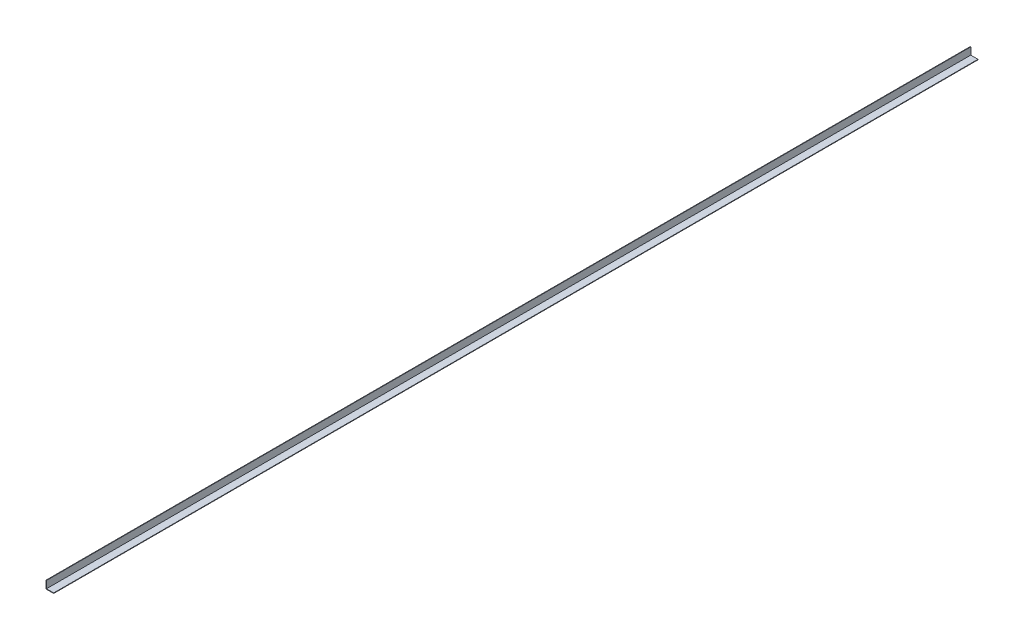
ISO-10303-21;
HEADER;
FILE_DESCRIPTION(('STEP AP214'),'2;1');
FILE_NAME('part.step','',(''),(''),'','','');
FILE_SCHEMA(('AUTOMOTIVE_DESIGN { 1 0 10303 214 1 1 1 1 }'));
ENDSEC;
DATA;
#1=APPLICATION_CONTEXT('core data for automotive mechanical design processes');
#2=APPLICATION_PROTOCOL_DEFINITION('international standard','automotive_design',2000,#1);
#3=PRODUCT_CONTEXT('',#1,'mechanical');
#4=PRODUCT('Part','Part','',(#3));
#5=PRODUCT_RELATED_PRODUCT_CATEGORY('part','',(#4));
#6=PRODUCT_DEFINITION_FORMATION('','',#4);
#7=PRODUCT_DEFINITION_CONTEXT('part definition',#1,'design');
#8=PRODUCT_DEFINITION('design','',#6,#7);
#9=PRODUCT_DEFINITION_SHAPE('','',#8);
#10=(LENGTH_UNIT() NAMED_UNIT(*) SI_UNIT(.MILLI.,.METRE.));
#11=(NAMED_UNIT(*) PLANE_ANGLE_UNIT() SI_UNIT($,.RADIAN.));
#12=(NAMED_UNIT(*) SI_UNIT($,.STERADIAN.) SOLID_ANGLE_UNIT());
#13=UNCERTAINTY_MEASURE_WITH_UNIT(LENGTH_MEASURE(1.E-05),#10,'distance_accuracy_value','');
#14=(GEOMETRIC_REPRESENTATION_CONTEXT(3) GLOBAL_UNCERTAINTY_ASSIGNED_CONTEXT((#13)) GLOBAL_UNIT_ASSIGNED_CONTEXT((#10,
#11,#12)) REPRESENTATION_CONTEXT('',''));
#15=CARTESIAN_POINT('',(0.,0.,0.));
#16=DIRECTION('',(0.,0.,1.));
#17=DIRECTION('',(1.,0.,0.));
#18=AXIS2_PLACEMENT_3D('',#15,#16,#17);
#19=CARTESIAN_POINT('',(3.18,50.8,-6100.));
#20=DIRECTION('',(0.,1.,0.));
#21=DIRECTION('',(0.,0.,1.));
#22=AXIS2_PLACEMENT_3D('',#19,#20,#21);
#23=PLANE('',#22);
#24=DIRECTION('',(-1.,0.,0.));
#25=VECTOR('',#24,1.);
#26=CARTESIAN_POINT('',(3.18,50.8,0.));
#27=LINE('',#26,#25);
#28=CARTESIAN_POINT('',(3.18,50.8,0.));
#29=VERTEX_POINT('',#28);
#30=CARTESIAN_POINT('',(0.,50.8,0.));
#31=VERTEX_POINT('',#30);
#32=EDGE_CURVE('E118',#29,#31,#27,.T.);
#33=ORIENTED_EDGE('',*,*,#32,.F.);
#34=DIRECTION('',(0.,0.,1.));
#35=VECTOR('',#34,1.);
#36=CARTESIAN_POINT('',(3.18,50.8,-6100.));
#37=LINE('',#36,#35);
#38=CARTESIAN_POINT('',(3.18,50.8,-6100.));
#39=VERTEX_POINT('',#38);
#40=EDGE_CURVE('E11',#39,#29,#37,.T.);
#41=ORIENTED_EDGE('',*,*,#40,.F.);
#42=DIRECTION('',(-1.,0.,0.));
#43=VECTOR('',#42,1.);
#44=CARTESIAN_POINT('',(3.18,50.8,-6100.));
#45=LINE('',#44,#43);
#46=CARTESIAN_POINT('',(0.,50.8,-6100.));
#47=VERTEX_POINT('',#46);
#48=EDGE_CURVE('E132',#39,#47,#45,.T.);
#49=ORIENTED_EDGE('',*,*,#48,.T.);
#50=DIRECTION('',(0.,0.,1.));
#51=VECTOR('',#50,1.);
#52=CARTESIAN_POINT('',(0.,50.8,-6100.));
#53=LINE('',#52,#51);
#54=EDGE_CURVE('E36',#47,#31,#53,.T.);
#55=ORIENTED_EDGE('',*,*,#54,.T.);
#56=EDGE_LOOP('',(#33,#41,#49,#55));
#57=FACE_BOUND('',#56,.T.);
#58=ADVANCED_FACE('F33',(#57),#23,.T.);
#59=CARTESIAN_POINT('',(3.18,3.18,-6100.));
#60=DIRECTION('',(1.,0.,0.));
#61=DIRECTION('',(0.,1.,0.));
#62=AXIS2_PLACEMENT_3D('',#59,#60,#61);
#63=PLANE('',#62);
#64=DIRECTION('',(0.,1.,0.));
#65=VECTOR('',#64,1.);
#66=CARTESIAN_POINT('',(3.18,3.18,0.));
#67=LINE('',#66,#65);
#68=CARTESIAN_POINT('',(3.18,3.18,0.));
#69=VERTEX_POINT('',#68);
#70=EDGE_CURVE('E130',#69,#29,#67,.T.);
#71=ORIENTED_EDGE('',*,*,#70,.F.);
#72=DIRECTION('',(0.,0.,1.));
#73=VECTOR('',#72,1.);
#74=CARTESIAN_POINT('',(3.18,3.18,-6100.));
#75=LINE('',#74,#73);
#76=CARTESIAN_POINT('',(3.18,3.18,-6100.));
#77=VERTEX_POINT('',#76);
#78=EDGE_CURVE('E42',#77,#69,#75,.T.);
#79=ORIENTED_EDGE('',*,*,#78,.F.);
#80=DIRECTION('',(0.,1.,0.));
#81=VECTOR('',#80,1.);
#82=CARTESIAN_POINT('',(3.18,3.18,-6100.));
#83=LINE('',#82,#81);
#84=EDGE_CURVE('E108',#77,#39,#83,.T.);
#85=ORIENTED_EDGE('',*,*,#84,.T.);
#86=ORIENTED_EDGE('',*,*,#40,.T.);
#87=EDGE_LOOP('',(#71,#79,#85,#86));
#88=FACE_BOUND('',#87,.T.);
#89=ADVANCED_FACE('F140',(#88),#63,.T.);
#90=CARTESIAN_POINT('',(50.8,3.18,-6100.));
#91=DIRECTION('',(0.,1.,0.));
#92=DIRECTION('',(-1.,0.,0.));
#93=AXIS2_PLACEMENT_3D('',#90,#91,#92);
#94=PLANE('',#93);
#95=DIRECTION('',(-1.,0.,0.));
#96=VECTOR('',#95,1.);
#97=CARTESIAN_POINT('',(50.8,3.18,0.));
#98=LINE('',#97,#96);
#99=CARTESIAN_POINT('',(50.8,3.18,0.));
#100=VERTEX_POINT('',#99);
#101=EDGE_CURVE('E95',#100,#69,#98,.T.);
#102=ORIENTED_EDGE('',*,*,#101,.F.);
#103=DIRECTION('',(0.,0.,1.));
#104=VECTOR('',#103,1.);
#105=CARTESIAN_POINT('',(50.8,3.18,-6100.));
#106=LINE('',#105,#104);
#107=CARTESIAN_POINT('',(50.8,3.18,-6100.));
#108=VERTEX_POINT('',#107);
#109=EDGE_CURVE('E90',#108,#100,#106,.T.);
#110=ORIENTED_EDGE('',*,*,#109,.F.);
#111=DIRECTION('',(-1.,0.,0.));
#112=VECTOR('',#111,1.);
#113=CARTESIAN_POINT('',(50.8,3.18,-6100.));
#114=LINE('',#113,#112);
#115=EDGE_CURVE('E93',#108,#77,#114,.T.);
#116=ORIENTED_EDGE('',*,*,#115,.T.);
#117=ORIENTED_EDGE('',*,*,#78,.T.);
#118=EDGE_LOOP('',(#102,#110,#116,#117));
#119=FACE_BOUND('',#118,.T.);
#120=ADVANCED_FACE('F92',(#119),#94,.T.);
#121=CARTESIAN_POINT('',(50.8,0.,-6100.));
#122=DIRECTION('',(1.,0.,0.));
#123=DIRECTION('',(0.,0.,-1.));
#124=AXIS2_PLACEMENT_3D('',#121,#122,#123);
#125=PLANE('',#124);
#126=DIRECTION('',(0.,1.,0.));
#127=VECTOR('',#126,1.);
#128=CARTESIAN_POINT('',(50.8,0.,0.));
#129=LINE('',#128,#127);
#130=CARTESIAN_POINT('',(50.8,0.,0.));
#131=VERTEX_POINT('',#130);
#132=EDGE_CURVE('E127',#131,#100,#129,.T.);
#133=ORIENTED_EDGE('',*,*,#132,.F.);
#134=DIRECTION('',(0.,0.,1.));
#135=VECTOR('',#134,1.);
#136=CARTESIAN_POINT('',(50.8,0.,-6100.));
#137=LINE('',#136,#135);
#138=CARTESIAN_POINT('',(50.8,0.,-6100.));
#139=VERTEX_POINT('',#138);
#140=EDGE_CURVE('E100',#139,#131,#137,.T.);
#141=ORIENTED_EDGE('',*,*,#140,.F.);
#142=DIRECTION('',(0.,1.,0.));
#143=VECTOR('',#142,1.);
#144=CARTESIAN_POINT('',(50.8,0.,-6100.));
#145=LINE('',#144,#143);
#146=EDGE_CURVE('E106',#139,#108,#145,.T.);
#147=ORIENTED_EDGE('',*,*,#146,.T.);
#148=ORIENTED_EDGE('',*,*,#109,.T.);
#149=EDGE_LOOP('',(#133,#141,#147,#148));
#150=FACE_BOUND('',#149,.T.);
#151=ADVANCED_FACE('F110',(#150),#125,.T.);
#152=CARTESIAN_POINT('',(0.,0.,-6100.));
#153=DIRECTION('',(0.,-1.,0.));
#154=DIRECTION('',(0.,0.,-1.));
#155=AXIS2_PLACEMENT_3D('',#152,#153,#154);
#156=PLANE('',#155);
#157=DIRECTION('',(1.,0.,0.));
#158=VECTOR('',#157,1.);
#159=CARTESIAN_POINT('',(0.,0.,0.));
#160=LINE('',#159,#158);
#161=CARTESIAN_POINT('',(0.,0.,0.));
#162=VERTEX_POINT('',#161);
#163=EDGE_CURVE('E124',#162,#131,#160,.T.);
#164=ORIENTED_EDGE('',*,*,#163,.F.);
#165=DIRECTION('',(0.,0.,1.));
#166=VECTOR('',#165,1.);
#167=CARTESIAN_POINT('',(0.,0.,-6100.));
#168=LINE('',#167,#166);
#169=CARTESIAN_POINT('',(0.,0.,-6100.));
#170=VERTEX_POINT('',#169);
#171=EDGE_CURVE('E135',#170,#162,#168,.T.);
#172=ORIENTED_EDGE('',*,*,#171,.F.);
#173=DIRECTION('',(1.,0.,0.));
#174=VECTOR('',#173,1.);
#175=CARTESIAN_POINT('',(0.,0.,-6100.));
#176=LINE('',#175,#174);
#177=EDGE_CURVE('E111',#170,#139,#176,.T.);
#178=ORIENTED_EDGE('',*,*,#177,.T.);
#179=ORIENTED_EDGE('',*,*,#140,.T.);
#180=EDGE_LOOP('',(#164,#172,#178,#179));
#181=FACE_BOUND('',#180,.T.);
#182=ADVANCED_FACE('F153',(#181),#156,.T.);
#183=CARTESIAN_POINT('',(0.,50.8,-6100.));
#184=DIRECTION('',(-1.,0.,0.));
#185=DIRECTION('',(0.,-1.,0.));
#186=AXIS2_PLACEMENT_3D('',#183,#184,#185);
#187=PLANE('',#186);
#188=DIRECTION('',(0.,-1.,0.));
#189=VECTOR('',#188,1.);
#190=CARTESIAN_POINT('',(0.,50.8,0.));
#191=LINE('',#190,#189);
#192=EDGE_CURVE('E121',#31,#162,#191,.T.);
#193=ORIENTED_EDGE('',*,*,#192,.F.);
#194=ORIENTED_EDGE('',*,*,#54,.F.);
#195=DIRECTION('',(0.,-1.,0.));
#196=VECTOR('',#195,1.);
#197=CARTESIAN_POINT('',(0.,50.8,-6100.));
#198=LINE('',#197,#196);
#199=EDGE_CURVE('E113',#47,#170,#198,.T.);
#200=ORIENTED_EDGE('',*,*,#199,.T.);
#201=ORIENTED_EDGE('',*,*,#171,.T.);
#202=EDGE_LOOP('',(#193,#194,#200,#201));
#203=FACE_BOUND('',#202,.T.);
#204=ADVANCED_FACE('F137',(#203),#187,.T.);
#205=CARTESIAN_POINT('',(0.,0.,-6100.));
#206=DIRECTION('',(0.,0.,1.));
#207=DIRECTION('',(1.,0.,0.));
#208=AXIS2_PLACEMENT_3D('',#205,#206,#207);
#209=PLANE('',#208);
#210=ORIENTED_EDGE('',*,*,#48,.F.);
#211=ORIENTED_EDGE('',*,*,#84,.F.);
#212=ORIENTED_EDGE('',*,*,#115,.F.);
#213=ORIENTED_EDGE('',*,*,#146,.F.);
#214=ORIENTED_EDGE('',*,*,#177,.F.);
#215=ORIENTED_EDGE('',*,*,#199,.F.);
#216=EDGE_LOOP('',(#210,#211,#212,#213,#214,#215));
#217=FACE_BOUND('',#216,.T.);
#218=ADVANCED_FACE('F104',(#217),#209,.F.);
#219=CARTESIAN_POINT('',(0.,0.,0.));
#220=DIRECTION('',(0.,0.,1.));
#221=DIRECTION('',(1.,0.,0.));
#222=AXIS2_PLACEMENT_3D('',#219,#220,#221);
#223=PLANE('',#222);
#224=ORIENTED_EDGE('',*,*,#32,.T.);
#225=ORIENTED_EDGE('',*,*,#192,.T.);
#226=ORIENTED_EDGE('',*,*,#163,.T.);
#227=ORIENTED_EDGE('',*,*,#132,.T.);
#228=ORIENTED_EDGE('',*,*,#101,.T.);
#229=ORIENTED_EDGE('',*,*,#70,.T.);
#230=EDGE_LOOP('',(#224,#225,#226,#227,#228,#229));
#231=FACE_BOUND('',#230,.T.);
#232=ADVANCED_FACE('F139',(#231),#223,.T.);
#233=CLOSED_SHELL('',(#58,#89,#120,#151,#182,#204,#218,#232));
#234=MANIFOLD_SOLID_BREP('B2',#233);
#235=ADVANCED_BREP_SHAPE_REPRESENTATION('',(#18,#234),#14);
#236=SHAPE_DEFINITION_REPRESENTATION(#9,#235);
ENDSEC;
END-ISO-10303-21;
